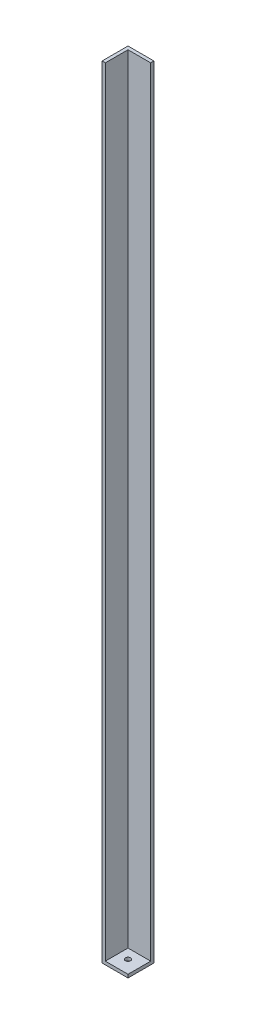
ISO-10303-21;
HEADER;
FILE_DESCRIPTION(('STEP AP214'),'2;1');
FILE_NAME('part.step','',(''),(''),'','','');
FILE_SCHEMA(('AUTOMOTIVE_DESIGN { 1 0 10303 214 1 1 1 1 }'));
ENDSEC;
DATA;
#1=APPLICATION_CONTEXT('core data for automotive mechanical design processes');
#2=APPLICATION_PROTOCOL_DEFINITION('international standard','automotive_design',2000,#1);
#3=PRODUCT_CONTEXT('',#1,'mechanical');
#4=PRODUCT('Part','Part','',(#3));
#5=PRODUCT_RELATED_PRODUCT_CATEGORY('part','',(#4));
#6=PRODUCT_DEFINITION_FORMATION('','',#4);
#7=PRODUCT_DEFINITION_CONTEXT('part definition',#1,'design');
#8=PRODUCT_DEFINITION('design','',#6,#7);
#9=PRODUCT_DEFINITION_SHAPE('','',#8);
#10=(LENGTH_UNIT() NAMED_UNIT(*) SI_UNIT(.MILLI.,.METRE.));
#11=(NAMED_UNIT(*) PLANE_ANGLE_UNIT() SI_UNIT($,.RADIAN.));
#12=(NAMED_UNIT(*) SI_UNIT($,.STERADIAN.) SOLID_ANGLE_UNIT());
#13=UNCERTAINTY_MEASURE_WITH_UNIT(LENGTH_MEASURE(1.E-05),#10,'distance_accuracy_value','');
#14=(GEOMETRIC_REPRESENTATION_CONTEXT(3) GLOBAL_UNCERTAINTY_ASSIGNED_CONTEXT((#13)) GLOBAL_UNIT_ASSIGNED_CONTEXT((#10,
#11,#12)) REPRESENTATION_CONTEXT('',''));
#15=CARTESIAN_POINT('',(0.,0.,0.));
#16=DIRECTION('',(0.,0.,1.));
#17=DIRECTION('',(1.,0.,0.));
#18=AXIS2_PLACEMENT_3D('',#15,#16,#17);
#19=CARTESIAN_POINT('',(0.,5.,0.));
#20=DIRECTION('',(0.,-1.,0.));
#21=DIRECTION('',(0.,0.,-1.));
#22=AXIS2_PLACEMENT_3D('',#19,#20,#21);
#23=PLANE('',#22);
#24=CARTESIAN_POINT('',(0.,5.,0.));
#25=DIRECTION('',(0.,1.,0.));
#26=DIRECTION('',(0.,0.,1.));
#27=AXIS2_PLACEMENT_3D('',#24,#25,#26);
#28=CIRCLE('',#27,4.05);
#29=CARTESIAN_POINT('',(0.,5.,4.05));
#30=VERTEX_POINT('',#29);
#31=EDGE_CURVE('E140',#30,#30,#28,.T.);
#32=ORIENTED_EDGE('',*,*,#31,.F.);
#33=EDGE_LOOP('',(#32));
#34=FACE_BOUND('',#33,.T.);
#35=DIRECTION('',(1.,0.,0.));
#36=VECTOR('',#35,1.);
#37=CARTESIAN_POINT('',(-15.,5.,-15.));
#38=LINE('',#37,#36);
#39=CARTESIAN_POINT('',(-15.,5.,-15.));
#40=VERTEX_POINT('',#39);
#41=CARTESIAN_POINT('',(20.,5.,-15.));
#42=VERTEX_POINT('',#41);
#43=EDGE_CURVE('E130',#40,#42,#38,.T.);
#44=ORIENTED_EDGE('',*,*,#43,.F.);
#45=DIRECTION('',(0.,0.,-1.));
#46=VECTOR('',#45,1.);
#47=CARTESIAN_POINT('',(-15.,5.,20.));
#48=LINE('',#47,#46);
#49=CARTESIAN_POINT('',(-15.,5.,20.));
#50=VERTEX_POINT('',#49);
#51=EDGE_CURVE('E55',#50,#40,#48,.T.);
#52=ORIENTED_EDGE('',*,*,#51,.F.);
#53=DIRECTION('',(1.,0.,0.));
#54=VECTOR('',#53,1.);
#55=CARTESIAN_POINT('',(20.,5.,20.));
#56=LINE('',#55,#54);
#57=CARTESIAN_POINT('',(20.,5.,20.));
#58=VERTEX_POINT('',#57);
#59=EDGE_CURVE('E147',#50,#58,#56,.T.);
#60=ORIENTED_EDGE('',*,*,#59,.T.);
#61=DIRECTION('',(0.,0.,-1.));
#62=VECTOR('',#61,1.);
#63=CARTESIAN_POINT('',(20.,5.,-20.));
#64=LINE('',#63,#62);
#65=EDGE_CURVE('E50',#58,#42,#64,.T.);
#66=ORIENTED_EDGE('',*,*,#65,.T.);
#67=EDGE_LOOP('',(#44,#52,#60,#66));
#68=FACE_BOUND('',#67,.T.);
#69=ADVANCED_FACE('F35',(#34,#68),#23,.F.);
#70=CARTESIAN_POINT('',(-20.,5.,20.));
#71=DIRECTION('',(1.,0.,0.));
#72=DIRECTION('',(0.,0.,-1.));
#73=AXIS2_PLACEMENT_3D('',#70,#71,#72);
#74=PLANE('',#73);
#75=DIRECTION('',(0.,0.,1.));
#76=VECTOR('',#75,1.);
#77=CARTESIAN_POINT('',(-20.,0.,20.));
#78=LINE('',#77,#76);
#79=CARTESIAN_POINT('',(-20.,0.,-20.));
#80=VERTEX_POINT('',#79);
#81=CARTESIAN_POINT('',(-20.,0.,20.));
#82=VERTEX_POINT('',#81);
#83=EDGE_CURVE('E144',#80,#82,#78,.T.);
#84=ORIENTED_EDGE('',*,*,#83,.T.);
#85=DIRECTION('',(0.,-1.,0.));
#86=VECTOR('',#85,1.);
#87=CARTESIAN_POINT('',(-20.,5.,20.));
#88=LINE('',#87,#86);
#89=CARTESIAN_POINT('',(-20.,1205.,20.));
#90=VERTEX_POINT('',#89);
#91=EDGE_CURVE('E11',#90,#82,#88,.T.);
#92=ORIENTED_EDGE('',*,*,#91,.F.);
#93=DIRECTION('',(0.,0.,1.));
#94=VECTOR('',#93,1.);
#95=CARTESIAN_POINT('',(-20.,1205.,-20.));
#96=LINE('',#95,#94);
#97=CARTESIAN_POINT('',(-20.,1205.,-20.));
#98=VERTEX_POINT('',#97);
#99=EDGE_CURVE('E127',#98,#90,#96,.T.);
#100=ORIENTED_EDGE('',*,*,#99,.F.);
#101=DIRECTION('',(0.,-1.,0.));
#102=VECTOR('',#101,1.);
#103=CARTESIAN_POINT('',(-20.,5.,-20.));
#104=LINE('',#103,#102);
#105=EDGE_CURVE('E105',#98,#80,#104,.T.);
#106=ORIENTED_EDGE('',*,*,#105,.T.);
#107=EDGE_LOOP('',(#84,#92,#100,#106));
#108=FACE_BOUND('',#107,.T.);
#109=ADVANCED_FACE('F37',(#108),#74,.F.);
#110=CARTESIAN_POINT('',(20.,5.,20.));
#111=DIRECTION('',(0.,0.,-1.));
#112=DIRECTION('',(-1.,0.,0.));
#113=AXIS2_PLACEMENT_3D('',#110,#111,#112);
#114=PLANE('',#113);
#115=DIRECTION('',(1.,0.,0.));
#116=VECTOR('',#115,1.);
#117=CARTESIAN_POINT('',(20.,0.,20.));
#118=LINE('',#117,#116);
#119=CARTESIAN_POINT('',(20.,0.,20.));
#120=VERTEX_POINT('',#119);
#121=EDGE_CURVE('E153',#82,#120,#118,.T.);
#122=ORIENTED_EDGE('',*,*,#121,.T.);
#123=DIRECTION('',(0.,-1.,0.));
#124=VECTOR('',#123,1.);
#125=CARTESIAN_POINT('',(20.,5.,20.));
#126=LINE('',#125,#124);
#127=EDGE_CURVE('E43',#58,#120,#126,.T.);
#128=ORIENTED_EDGE('',*,*,#127,.F.);
#129=ORIENTED_EDGE('',*,*,#59,.F.);
#130=DIRECTION('',(0.,-1.,0.));
#131=VECTOR('',#130,1.);
#132=CARTESIAN_POINT('',(-15.,605.,20.));
#133=LINE('',#132,#131);
#134=CARTESIAN_POINT('',(-15.,1205.,20.));
#135=VERTEX_POINT('',#134);
#136=EDGE_CURVE('E137',#135,#50,#133,.T.);
#137=ORIENTED_EDGE('',*,*,#136,.F.);
#138=DIRECTION('',(1.,0.,0.));
#139=VECTOR('',#138,1.);
#140=CARTESIAN_POINT('',(-20.,1205.,20.));
#141=LINE('',#140,#139);
#142=EDGE_CURVE('E124',#90,#135,#141,.T.);
#143=ORIENTED_EDGE('',*,*,#142,.F.);
#144=ORIENTED_EDGE('',*,*,#91,.T.);
#145=EDGE_LOOP('',(#122,#128,#129,#137,#143,#144));
#146=FACE_BOUND('',#145,.T.);
#147=ADVANCED_FACE('F165',(#146),#114,.F.);
#148=CARTESIAN_POINT('',(20.,5.,-20.));
#149=DIRECTION('',(-1.,0.,0.));
#150=DIRECTION('',(0.,0.,1.));
#151=AXIS2_PLACEMENT_3D('',#148,#149,#150);
#152=PLANE('',#151);
#153=DIRECTION('',(0.,0.,-1.));
#154=VECTOR('',#153,1.);
#155=CARTESIAN_POINT('',(20.,0.,-20.));
#156=LINE('',#155,#154);
#157=CARTESIAN_POINT('',(20.,0.,-20.));
#158=VERTEX_POINT('',#157);
#159=EDGE_CURVE('E102',#120,#158,#156,.T.);
#160=ORIENTED_EDGE('',*,*,#159,.T.);
#161=DIRECTION('',(0.,-1.,0.));
#162=VECTOR('',#161,1.);
#163=CARTESIAN_POINT('',(20.,5.,-20.));
#164=LINE('',#163,#162);
#165=CARTESIAN_POINT('',(20.,1205.,-20.));
#166=VERTEX_POINT('',#165);
#167=EDGE_CURVE('E93',#166,#158,#164,.T.);
#168=ORIENTED_EDGE('',*,*,#167,.F.);
#169=DIRECTION('',(0.,0.,-1.));
#170=VECTOR('',#169,1.);
#171=CARTESIAN_POINT('',(20.,1205.,-15.));
#172=LINE('',#171,#170);
#173=CARTESIAN_POINT('',(20.,1205.,-15.));
#174=VERTEX_POINT('',#173);
#175=EDGE_CURVE('E98',#174,#166,#172,.T.);
#176=ORIENTED_EDGE('',*,*,#175,.F.);
#177=DIRECTION('',(0.,-1.,0.));
#178=VECTOR('',#177,1.);
#179=CARTESIAN_POINT('',(20.,605.,-15.));
#180=LINE('',#179,#178);
#181=EDGE_CURVE('E132',#174,#42,#180,.T.);
#182=ORIENTED_EDGE('',*,*,#181,.T.);
#183=ORIENTED_EDGE('',*,*,#65,.F.);
#184=ORIENTED_EDGE('',*,*,#127,.T.);
#185=EDGE_LOOP('',(#160,#168,#176,#182,#183,#184));
#186=FACE_BOUND('',#185,.T.);
#187=ADVANCED_FACE('F95',(#186),#152,.F.);
#188=CARTESIAN_POINT('',(-20.,5.,-20.));
#189=DIRECTION('',(0.,0.,1.));
#190=DIRECTION('',(1.,0.,0.));
#191=AXIS2_PLACEMENT_3D('',#188,#189,#190);
#192=PLANE('',#191);
#193=DIRECTION('',(-1.,0.,0.));
#194=VECTOR('',#193,1.);
#195=CARTESIAN_POINT('',(-20.,0.,-20.));
#196=LINE('',#195,#194);
#197=EDGE_CURVE('E149',#158,#80,#196,.T.);
#198=ORIENTED_EDGE('',*,*,#197,.T.);
#199=ORIENTED_EDGE('',*,*,#105,.F.);
#200=DIRECTION('',(-1.,0.,0.));
#201=VECTOR('',#200,1.);
#202=CARTESIAN_POINT('',(20.,1205.,-20.));
#203=LINE('',#202,#201);
#204=EDGE_CURVE('E108',#166,#98,#203,.T.);
#205=ORIENTED_EDGE('',*,*,#204,.F.);
#206=ORIENTED_EDGE('',*,*,#167,.T.);
#207=EDGE_LOOP('',(#198,#199,#205,#206));
#208=FACE_BOUND('',#207,.T.);
#209=ADVANCED_FACE('F109',(#208),#192,.F.);
#210=CARTESIAN_POINT('',(0.,0.,0.));
#211=DIRECTION('',(0.,-1.,0.));
#212=DIRECTION('',(0.,0.,-1.));
#213=AXIS2_PLACEMENT_3D('',#210,#211,#212);
#214=PLANE('',#213);
#215=CARTESIAN_POINT('',(0.,0.,0.));
#216=DIRECTION('',(0.,1.,0.));
#217=DIRECTION('',(0.,0.,1.));
#218=AXIS2_PLACEMENT_3D('',#215,#216,#217);
#219=CIRCLE('',#218,4.05);
#220=CARTESIAN_POINT('',(0.,0.,4.05));
#221=VERTEX_POINT('',#220);
#222=EDGE_CURVE('E141',#221,#221,#219,.T.);
#223=ORIENTED_EDGE('',*,*,#222,.T.);
#224=EDGE_LOOP('',(#223));
#225=FACE_BOUND('',#224,.T.);
#226=ORIENTED_EDGE('',*,*,#83,.F.);
#227=ORIENTED_EDGE('',*,*,#197,.F.);
#228=ORIENTED_EDGE('',*,*,#159,.F.);
#229=ORIENTED_EDGE('',*,*,#121,.F.);
#230=EDGE_LOOP('',(#226,#227,#228,#229));
#231=FACE_BOUND('',#230,.T.);
#232=ADVANCED_FACE('F161',(#225,#231),#214,.T.);
#233=CARTESIAN_POINT('',(0.,0.,0.));
#234=DIRECTION('',(0.,1.,0.));
#235=DIRECTION('',(0.,0.,1.));
#236=AXIS2_PLACEMENT_3D('',#233,#234,#235);
#237=CYLINDRICAL_SURFACE('',#236,4.05);
#238=ORIENTED_EDGE('',*,*,#222,.F.);
#239=EDGE_LOOP('',(#238));
#240=FACE_BOUND('',#239,.T.);
#241=ORIENTED_EDGE('',*,*,#31,.T.);
#242=EDGE_LOOP('',(#241));
#243=FACE_BOUND('',#242,.T.);
#244=ADVANCED_FACE('F179',(#240,#243),#237,.F.);
#245=CARTESIAN_POINT('',(-15.,605.,20.));
#246=DIRECTION('',(-1.,0.,0.));
#247=DIRECTION('',(0.,0.,1.));
#248=AXIS2_PLACEMENT_3D('',#245,#246,#247);
#249=PLANE('',#248);
#250=ORIENTED_EDGE('',*,*,#51,.T.);
#251=DIRECTION('',(0.,-1.,0.));
#252=VECTOR('',#251,1.);
#253=CARTESIAN_POINT('',(-15.,605.,-15.));
#254=LINE('',#253,#252);
#255=CARTESIAN_POINT('',(-15.,1205.,-15.));
#256=VERTEX_POINT('',#255);
#257=EDGE_CURVE('E134',#256,#40,#254,.T.);
#258=ORIENTED_EDGE('',*,*,#257,.F.);
#259=DIRECTION('',(0.,0.,-1.));
#260=VECTOR('',#259,1.);
#261=CARTESIAN_POINT('',(-15.,1205.,20.));
#262=LINE('',#261,#260);
#263=EDGE_CURVE('E120',#135,#256,#262,.T.);
#264=ORIENTED_EDGE('',*,*,#263,.F.);
#265=ORIENTED_EDGE('',*,*,#136,.T.);
#266=EDGE_LOOP('',(#250,#258,#264,#265));
#267=FACE_BOUND('',#266,.T.);
#268=ADVANCED_FACE('F167',(#267),#249,.F.);
#269=CARTESIAN_POINT('',(-15.,605.,-15.));
#270=DIRECTION('',(0.,0.,-1.));
#271=DIRECTION('',(-1.,0.,0.));
#272=AXIS2_PLACEMENT_3D('',#269,#270,#271);
#273=PLANE('',#272);
#274=ORIENTED_EDGE('',*,*,#43,.T.);
#275=ORIENTED_EDGE('',*,*,#181,.F.);
#276=DIRECTION('',(1.,0.,0.));
#277=VECTOR('',#276,1.);
#278=CARTESIAN_POINT('',(-15.,1205.,-15.));
#279=LINE('',#278,#277);
#280=EDGE_CURVE('E118',#256,#174,#279,.T.);
#281=ORIENTED_EDGE('',*,*,#280,.F.);
#282=ORIENTED_EDGE('',*,*,#257,.T.);
#283=EDGE_LOOP('',(#274,#275,#281,#282));
#284=FACE_BOUND('',#283,.T.);
#285=ADVANCED_FACE('F169',(#284),#273,.F.);
#286=CARTESIAN_POINT('',(0.,1205.,0.));
#287=DIRECTION('',(0.,-1.,0.));
#288=DIRECTION('',(0.,0.,1.));
#289=AXIS2_PLACEMENT_3D('',#286,#287,#288);
#290=PLANE('',#289);
#291=ORIENTED_EDGE('',*,*,#204,.T.);
#292=ORIENTED_EDGE('',*,*,#99,.T.);
#293=ORIENTED_EDGE('',*,*,#142,.T.);
#294=ORIENTED_EDGE('',*,*,#263,.T.);
#295=ORIENTED_EDGE('',*,*,#280,.T.);
#296=ORIENTED_EDGE('',*,*,#175,.T.);
#297=EDGE_LOOP('',(#291,#292,#293,#294,#295,#296));
#298=FACE_BOUND('',#297,.T.);
#299=ADVANCED_FACE('F115',(#298),#290,.F.);
#300=CLOSED_SHELL('',(#69,#109,#147,#187,#209,#232,#244,#268,#285,#299));
#301=MANIFOLD_SOLID_BREP('B2',#300);
#302=ADVANCED_BREP_SHAPE_REPRESENTATION('',(#18,#301),#14);
#303=SHAPE_DEFINITION_REPRESENTATION(#9,#302);
ENDSEC;
END-ISO-10303-21;
